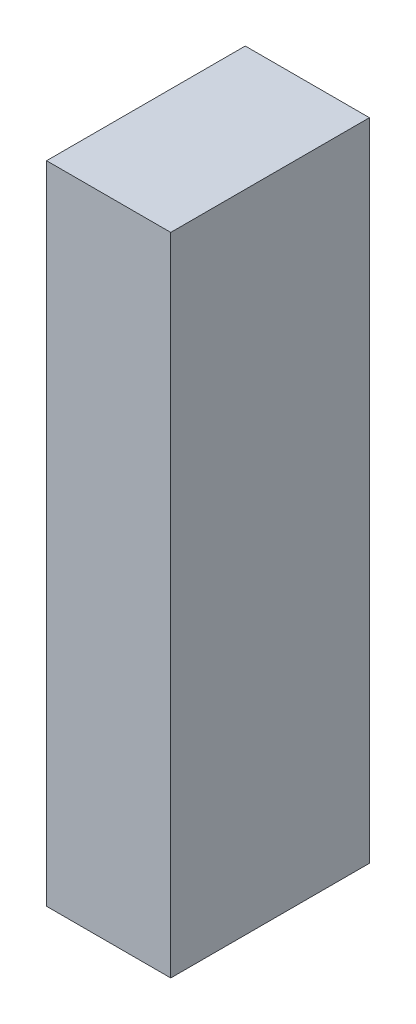
ISO-10303-21;
HEADER;
FILE_DESCRIPTION(('STEP AP214'),'2;1');
FILE_NAME('part.step','',(''),(''),'','','');
FILE_SCHEMA(('AUTOMOTIVE_DESIGN { 1 0 10303 214 1 1 1 1 }'));
ENDSEC;
DATA;
#1=APPLICATION_CONTEXT('core data for automotive mechanical design processes');
#2=APPLICATION_PROTOCOL_DEFINITION('international standard','automotive_design',2000,#1);
#3=PRODUCT_CONTEXT('',#1,'mechanical');
#4=PRODUCT('Part','Part','',(#3));
#5=PRODUCT_RELATED_PRODUCT_CATEGORY('part','',(#4));
#6=PRODUCT_DEFINITION_FORMATION('','',#4);
#7=PRODUCT_DEFINITION_CONTEXT('part definition',#1,'design');
#8=PRODUCT_DEFINITION('design','',#6,#7);
#9=PRODUCT_DEFINITION_SHAPE('','',#8);
#10=(LENGTH_UNIT() NAMED_UNIT(*) SI_UNIT(.MILLI.,.METRE.));
#11=(NAMED_UNIT(*) PLANE_ANGLE_UNIT() SI_UNIT($,.RADIAN.));
#12=(NAMED_UNIT(*) SI_UNIT($,.STERADIAN.) SOLID_ANGLE_UNIT());
#13=UNCERTAINTY_MEASURE_WITH_UNIT(LENGTH_MEASURE(1.E-05),#10,'distance_accuracy_value','');
#14=(GEOMETRIC_REPRESENTATION_CONTEXT(3) GLOBAL_UNCERTAINTY_ASSIGNED_CONTEXT((#13)) GLOBAL_UNIT_ASSIGNED_CONTEXT((#10,
#11,#12)) REPRESENTATION_CONTEXT('',''));
#15=CARTESIAN_POINT('',(0.,0.,0.));
#16=DIRECTION('',(0.,0.,1.));
#17=DIRECTION('',(1.,0.,0.));
#18=AXIS2_PLACEMENT_3D('',#15,#16,#17);
#19=CARTESIAN_POINT('',(0.,0.,0.));
#20=DIRECTION('',(1.,0.,0.));
#21=DIRECTION('',(0.,0.,-1.));
#22=AXIS2_PLACEMENT_3D('',#19,#20,#21);
#23=PLANE('',#22);
#24=DIRECTION('',(0.,0.,-1.));
#25=VECTOR('',#24,1.);
#26=CARTESIAN_POINT('',(0.,-0.65,0.));
#27=LINE('',#26,#25);
#28=CARTESIAN_POINT('',(0.,-0.65,2.8));
#29=VERTEX_POINT('',#28);
#30=CARTESIAN_POINT('',(0.,-0.65,2.4));
#31=VERTEX_POINT('',#30);
#32=EDGE_CURVE('E20',#29,#31,#27,.T.);
#33=ORIENTED_EDGE('',*,*,#32,.F.);
#34=DIRECTION('',(0.,1.,0.));
#35=VECTOR('',#34,1.);
#36=CARTESIAN_POINT('',(0.,-0.65,2.8));
#37=LINE('',#36,#35);
#38=CARTESIAN_POINT('',(0.,0.65,2.8));
#39=VERTEX_POINT('',#38);
#40=EDGE_CURVE('E55',#39,#29,#37,.F.);
#41=ORIENTED_EDGE('',*,*,#40,.F.);
#42=DIRECTION('',(0.,0.,-1.));
#43=VECTOR('',#42,1.);
#44=CARTESIAN_POINT('',(0.,0.65,2.4));
#45=LINE('',#44,#43);
#46=CARTESIAN_POINT('',(0.,0.65,2.4));
#47=VERTEX_POINT('',#46);
#48=EDGE_CURVE('E68',#39,#47,#45,.T.);
#49=ORIENTED_EDGE('',*,*,#48,.T.);
#50=DIRECTION('',(0.,1.,0.));
#51=VECTOR('',#50,1.);
#52=CARTESIAN_POINT('',(0.,-0.65,2.4));
#53=LINE('',#52,#51);
#54=EDGE_CURVE('E61',#47,#31,#53,.F.);
#55=ORIENTED_EDGE('',*,*,#54,.T.);
#56=EDGE_LOOP('',(#33,#41,#49,#55));
#57=FACE_BOUND('',#56,.T.);
#58=ADVANCED_FACE('F17',(#57),#23,.F.);
#59=CARTESIAN_POINT('',(0.25,-0.65,2.4));
#60=DIRECTION('',(0.,0.,1.));
#61=DIRECTION('',(1.,0.,0.));
#62=AXIS2_PLACEMENT_3D('',#59,#60,#61);
#63=PLANE('',#62);
#64=DIRECTION('',(1.,0.,0.));
#65=VECTOR('',#64,1.);
#66=CARTESIAN_POINT('',(0.25,0.65,2.4));
#67=LINE('',#66,#65);
#68=CARTESIAN_POINT('',(0.25,0.65,2.4));
#69=VERTEX_POINT('',#68);
#70=EDGE_CURVE('E64',#47,#69,#67,.T.);
#71=ORIENTED_EDGE('',*,*,#70,.T.);
#72=DIRECTION('',(0.,1.,0.));
#73=VECTOR('',#72,1.);
#74=CARTESIAN_POINT('',(0.25,0.,2.4));
#75=LINE('',#74,#73);
#76=CARTESIAN_POINT('',(0.25,-0.65,2.4));
#77=VERTEX_POINT('',#76);
#78=EDGE_CURVE('E83',#77,#69,#75,.T.);
#79=ORIENTED_EDGE('',*,*,#78,.F.);
#80=DIRECTION('',(1.,0.,0.));
#81=VECTOR('',#80,1.);
#82=CARTESIAN_POINT('',(0.25,-0.65,2.4));
#83=LINE('',#82,#81);
#84=EDGE_CURVE('E67',#31,#77,#83,.T.);
#85=ORIENTED_EDGE('',*,*,#84,.F.);
#86=ORIENTED_EDGE('',*,*,#54,.F.);
#87=EDGE_LOOP('',(#71,#79,#85,#86));
#88=FACE_BOUND('',#87,.T.);
#89=ADVANCED_FACE('F62',(#88),#63,.F.);
#90=CARTESIAN_POINT('',(0.25,0.65,2.4));
#91=DIRECTION('',(0.,-1.,0.));
#92=DIRECTION('',(0.,0.,-1.));
#93=AXIS2_PLACEMENT_3D('',#90,#91,#92);
#94=PLANE('',#93);
#95=DIRECTION('',(1.,0.,0.));
#96=VECTOR('',#95,1.);
#97=CARTESIAN_POINT('',(0.25,0.65,2.8));
#98=LINE('',#97,#96);
#99=CARTESIAN_POINT('',(0.25,0.65,2.8));
#100=VERTEX_POINT('',#99);
#101=EDGE_CURVE('E79',#100,#39,#98,.F.);
#102=ORIENTED_EDGE('',*,*,#101,.F.);
#103=DIRECTION('',(0.,0.,-1.));
#104=VECTOR('',#103,1.);
#105=CARTESIAN_POINT('',(0.25,0.65,0.));
#106=LINE('',#105,#104);
#107=EDGE_CURVE('E74',#69,#100,#106,.F.);
#108=ORIENTED_EDGE('',*,*,#107,.F.);
#109=ORIENTED_EDGE('',*,*,#70,.F.);
#110=ORIENTED_EDGE('',*,*,#48,.F.);
#111=EDGE_LOOP('',(#102,#108,#109,#110));
#112=FACE_BOUND('',#111,.T.);
#113=ADVANCED_FACE('F72',(#112),#94,.F.);
#114=CARTESIAN_POINT('',(0.25,-0.65,2.8));
#115=DIRECTION('',(0.,0.,1.));
#116=DIRECTION('',(1.,0.,0.));
#117=AXIS2_PLACEMENT_3D('',#114,#115,#116);
#118=PLANE('',#117);
#119=DIRECTION('',(0.,1.,0.));
#120=VECTOR('',#119,1.);
#121=CARTESIAN_POINT('',(0.25,0.,2.8));
#122=LINE('',#121,#120);
#123=CARTESIAN_POINT('',(0.25,-0.65,2.8));
#124=VERTEX_POINT('',#123);
#125=EDGE_CURVE('E26',#100,#124,#122,.F.);
#126=ORIENTED_EDGE('',*,*,#125,.F.);
#127=ORIENTED_EDGE('',*,*,#101,.T.);
#128=ORIENTED_EDGE('',*,*,#40,.T.);
#129=DIRECTION('',(1.,0.,0.));
#130=VECTOR('',#129,1.);
#131=CARTESIAN_POINT('',(0.25,-0.65,2.8));
#132=LINE('',#131,#130);
#133=EDGE_CURVE('E35',#124,#29,#132,.F.);
#134=ORIENTED_EDGE('',*,*,#133,.F.);
#135=EDGE_LOOP('',(#126,#127,#128,#134));
#136=FACE_BOUND('',#135,.T.);
#137=ADVANCED_FACE('F89',(#136),#118,.T.);
#138=CARTESIAN_POINT('',(0.25,-0.65,2.4));
#139=DIRECTION('',(0.,-1.,0.));
#140=DIRECTION('',(0.,0.,-1.));
#141=AXIS2_PLACEMENT_3D('',#138,#139,#140);
#142=PLANE('',#141);
#143=DIRECTION('',(0.,0.,-1.));
#144=VECTOR('',#143,1.);
#145=CARTESIAN_POINT('',(0.25,-0.65,0.));
#146=LINE('',#145,#144);
#147=EDGE_CURVE('E11',#124,#77,#146,.T.);
#148=ORIENTED_EDGE('',*,*,#147,.F.);
#149=ORIENTED_EDGE('',*,*,#133,.T.);
#150=ORIENTED_EDGE('',*,*,#32,.T.);
#151=ORIENTED_EDGE('',*,*,#84,.T.);
#152=EDGE_LOOP('',(#148,#149,#150,#151));
#153=FACE_BOUND('',#152,.T.);
#154=ADVANCED_FACE('F91',(#153),#142,.T.);
#155=CARTESIAN_POINT('',(0.25,0.,0.));
#156=DIRECTION('',(1.,0.,0.));
#157=DIRECTION('',(0.,0.,-1.));
#158=AXIS2_PLACEMENT_3D('',#155,#156,#157);
#159=PLANE('',#158);
#160=ORIENTED_EDGE('',*,*,#125,.T.);
#161=ORIENTED_EDGE('',*,*,#147,.T.);
#162=ORIENTED_EDGE('',*,*,#78,.T.);
#163=ORIENTED_EDGE('',*,*,#107,.T.);
#164=EDGE_LOOP('',(#160,#161,#162,#163));
#165=FACE_BOUND('',#164,.T.);
#166=ADVANCED_FACE('F88',(#165),#159,.T.);
#167=CLOSED_SHELL('',(#58,#89,#113,#137,#154,#166));
#168=MANIFOLD_SOLID_BREP('B1',#167);
#169=ADVANCED_BREP_SHAPE_REPRESENTATION('',(#18,#168),#14);
#170=SHAPE_DEFINITION_REPRESENTATION(#9,#169);
ENDSEC;
END-ISO-10303-21;
